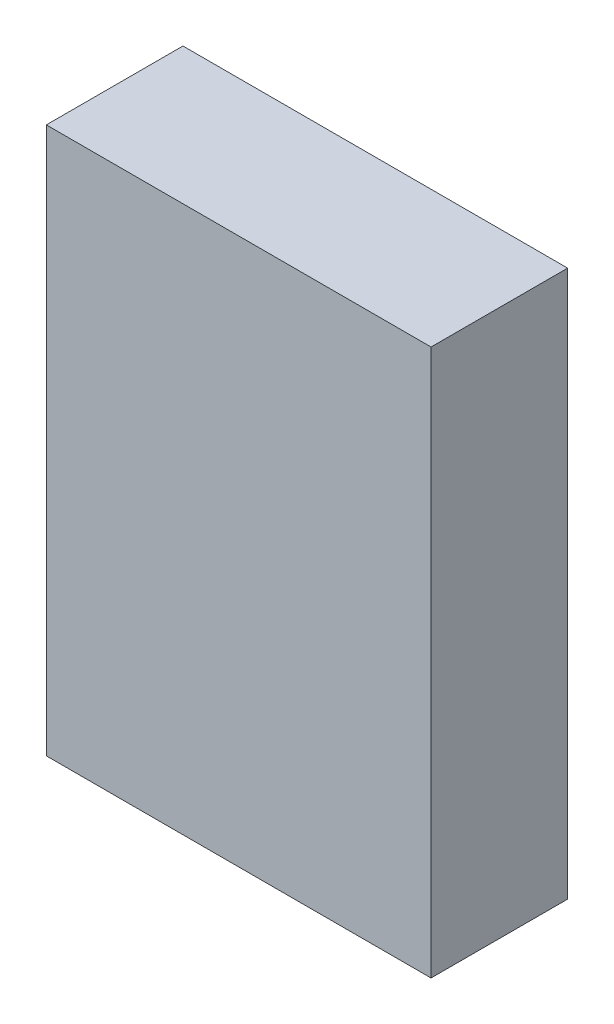
ISO-10303-21;
HEADER;
FILE_DESCRIPTION(('STEP AP214'),'2;1');
FILE_NAME('part.step','',(''),(''),'','','');
FILE_SCHEMA(('AUTOMOTIVE_DESIGN { 1 0 10303 214 1 1 1 1 }'));
ENDSEC;
DATA;
#1=APPLICATION_CONTEXT('core data for automotive mechanical design processes');
#2=APPLICATION_PROTOCOL_DEFINITION('international standard','automotive_design',2000,#1);
#3=PRODUCT_CONTEXT('',#1,'mechanical');
#4=PRODUCT('Part','Part','',(#3));
#5=PRODUCT_RELATED_PRODUCT_CATEGORY('part','',(#4));
#6=PRODUCT_DEFINITION_FORMATION('','',#4);
#7=PRODUCT_DEFINITION_CONTEXT('part definition',#1,'design');
#8=PRODUCT_DEFINITION('design','',#6,#7);
#9=PRODUCT_DEFINITION_SHAPE('','',#8);
#10=(LENGTH_UNIT() NAMED_UNIT(*) SI_UNIT(.MILLI.,.METRE.));
#11=(NAMED_UNIT(*) PLANE_ANGLE_UNIT() SI_UNIT($,.RADIAN.));
#12=(NAMED_UNIT(*) SI_UNIT($,.STERADIAN.) SOLID_ANGLE_UNIT());
#13=UNCERTAINTY_MEASURE_WITH_UNIT(LENGTH_MEASURE(1.E-05),#10,'distance_accuracy_value','');
#14=(GEOMETRIC_REPRESENTATION_CONTEXT(3) GLOBAL_UNCERTAINTY_ASSIGNED_CONTEXT((#13)) GLOBAL_UNIT_ASSIGNED_CONTEXT((#10,
#11,#12)) REPRESENTATION_CONTEXT('',''));
#15=CARTESIAN_POINT('',(0.,0.,0.));
#16=DIRECTION('',(0.,0.,1.));
#17=DIRECTION('',(1.,0.,0.));
#18=AXIS2_PLACEMENT_3D('',#15,#16,#17);
#19=CARTESIAN_POINT('',(0.,0.,50.));
#20=DIRECTION('',(-1.,0.,0.));
#21=DIRECTION('',(0.,-1.,0.));
#22=AXIS2_PLACEMENT_3D('',#19,#20,#21);
#23=PLANE('',#22);
#24=DIRECTION('',(0.,1.,0.));
#25=VECTOR('',#24,1.);
#26=CARTESIAN_POINT('',(0.,0.,0.));
#27=LINE('',#26,#25);
#28=CARTESIAN_POINT('',(0.,-200.,0.));
#29=VERTEX_POINT('',#28);
#30=CARTESIAN_POINT('',(0.,0.,0.));
#31=VERTEX_POINT('',#30);
#32=EDGE_CURVE('E96',#29,#31,#27,.T.);
#33=ORIENTED_EDGE('',*,*,#32,.T.);
#34=DIRECTION('',(0.,0.,-1.));
#35=VECTOR('',#34,1.);
#36=CARTESIAN_POINT('',(0.,0.,50.));
#37=LINE('',#36,#35);
#38=CARTESIAN_POINT('',(0.,0.,50.));
#39=VERTEX_POINT('',#38);
#40=EDGE_CURVE('E11',#39,#31,#37,.T.);
#41=ORIENTED_EDGE('',*,*,#40,.F.);
#42=DIRECTION('',(0.,1.,0.));
#43=VECTOR('',#42,1.);
#44=CARTESIAN_POINT('',(0.,0.,50.));
#45=LINE('',#44,#43);
#46=CARTESIAN_POINT('',(0.,-200.,50.));
#47=VERTEX_POINT('',#46);
#48=EDGE_CURVE('E84',#47,#39,#45,.T.);
#49=ORIENTED_EDGE('',*,*,#48,.F.);
#50=DIRECTION('',(0.,0.,-1.));
#51=VECTOR('',#50,1.);
#52=CARTESIAN_POINT('',(0.,-200.,50.));
#53=LINE('',#52,#51);
#54=EDGE_CURVE('E92',#47,#29,#53,.T.);
#55=ORIENTED_EDGE('',*,*,#54,.T.);
#56=EDGE_LOOP('',(#33,#41,#49,#55));
#57=FACE_BOUND('',#56,.T.);
#58=ADVANCED_FACE('F33',(#57),#23,.F.);
#59=CARTESIAN_POINT('',(0.,0.,50.));
#60=DIRECTION('',(0.,-1.,0.));
#61=DIRECTION('',(1.,0.,0.));
#62=AXIS2_PLACEMENT_3D('',#59,#60,#61);
#63=PLANE('',#62);
#64=DIRECTION('',(-1.,0.,0.));
#65=VECTOR('',#64,1.);
#66=CARTESIAN_POINT('',(0.,0.,0.));
#67=LINE('',#66,#65);
#68=CARTESIAN_POINT('',(-140.8,0.,0.));
#69=VERTEX_POINT('',#68);
#70=EDGE_CURVE('E88',#31,#69,#67,.T.);
#71=ORIENTED_EDGE('',*,*,#70,.T.);
#72=DIRECTION('',(0.,0.,-1.));
#73=VECTOR('',#72,1.);
#74=CARTESIAN_POINT('',(-140.8,0.,50.));
#75=LINE('',#74,#73);
#76=CARTESIAN_POINT('',(-140.8,0.,50.));
#77=VERTEX_POINT('',#76);
#78=EDGE_CURVE('E41',#77,#69,#75,.T.);
#79=ORIENTED_EDGE('',*,*,#78,.F.);
#80=DIRECTION('',(-1.,0.,0.));
#81=VECTOR('',#80,1.);
#82=CARTESIAN_POINT('',(0.,0.,50.));
#83=LINE('',#82,#81);
#84=EDGE_CURVE('E79',#39,#77,#83,.T.);
#85=ORIENTED_EDGE('',*,*,#84,.F.);
#86=ORIENTED_EDGE('',*,*,#40,.T.);
#87=EDGE_LOOP('',(#71,#79,#85,#86));
#88=FACE_BOUND('',#87,.T.);
#89=ADVANCED_FACE('F87',(#88),#63,.F.);
#90=CARTESIAN_POINT('',(-140.8,0.,50.));
#91=DIRECTION('',(1.,0.,0.));
#92=DIRECTION('',(0.,1.,0.));
#93=AXIS2_PLACEMENT_3D('',#90,#91,#92);
#94=PLANE('',#93);
#95=DIRECTION('',(0.,-1.,0.));
#96=VECTOR('',#95,1.);
#97=CARTESIAN_POINT('',(-140.8,0.,0.));
#98=LINE('',#97,#96);
#99=CARTESIAN_POINT('',(-140.8,-200.,0.));
#100=VERTEX_POINT('',#99);
#101=EDGE_CURVE('E66',#69,#100,#98,.T.);
#102=ORIENTED_EDGE('',*,*,#101,.T.);
#103=DIRECTION('',(0.,0.,-1.));
#104=VECTOR('',#103,1.);
#105=CARTESIAN_POINT('',(-140.8,-200.,50.));
#106=LINE('',#105,#104);
#107=CARTESIAN_POINT('',(-140.8,-200.,50.));
#108=VERTEX_POINT('',#107);
#109=EDGE_CURVE('E89',#108,#100,#106,.T.);
#110=ORIENTED_EDGE('',*,*,#109,.F.);
#111=DIRECTION('',(0.,-1.,0.));
#112=VECTOR('',#111,1.);
#113=CARTESIAN_POINT('',(-140.8,0.,50.));
#114=LINE('',#113,#112);
#115=EDGE_CURVE('E82',#77,#108,#114,.T.);
#116=ORIENTED_EDGE('',*,*,#115,.F.);
#117=ORIENTED_EDGE('',*,*,#78,.T.);
#118=EDGE_LOOP('',(#102,#110,#116,#117));
#119=FACE_BOUND('',#118,.T.);
#120=ADVANCED_FACE('F90',(#119),#94,.F.);
#121=CARTESIAN_POINT('',(0.,-200.,50.));
#122=DIRECTION('',(0.,1.,0.));
#123=DIRECTION('',(-1.,0.,0.));
#124=AXIS2_PLACEMENT_3D('',#121,#122,#123);
#125=PLANE('',#124);
#126=DIRECTION('',(1.,0.,0.));
#127=VECTOR('',#126,1.);
#128=CARTESIAN_POINT('',(0.,-200.,0.));
#129=LINE('',#128,#127);
#130=EDGE_CURVE('E72',#100,#29,#129,.T.);
#131=ORIENTED_EDGE('',*,*,#130,.T.);
#132=ORIENTED_EDGE('',*,*,#54,.F.);
#133=DIRECTION('',(1.,0.,0.));
#134=VECTOR('',#133,1.);
#135=CARTESIAN_POINT('',(0.,-200.,50.));
#136=LINE('',#135,#134);
#137=EDGE_CURVE('E49',#108,#47,#136,.T.);
#138=ORIENTED_EDGE('',*,*,#137,.F.);
#139=ORIENTED_EDGE('',*,*,#109,.T.);
#140=EDGE_LOOP('',(#131,#132,#138,#139));
#141=FACE_BOUND('',#140,.T.);
#142=ADVANCED_FACE('F103',(#141),#125,.F.);
#143=CARTESIAN_POINT('',(0.,0.,50.));
#144=DIRECTION('',(0.,0.,-1.));
#145=DIRECTION('',(-1.,0.,0.));
#146=AXIS2_PLACEMENT_3D('',#143,#144,#145);
#147=PLANE('',#146);
#148=ORIENTED_EDGE('',*,*,#48,.T.);
#149=ORIENTED_EDGE('',*,*,#84,.T.);
#150=ORIENTED_EDGE('',*,*,#115,.T.);
#151=ORIENTED_EDGE('',*,*,#137,.T.);
#152=EDGE_LOOP('',(#148,#149,#150,#151));
#153=FACE_BOUND('',#152,.T.);
#154=ADVANCED_FACE('F80',(#153),#147,.F.);
#155=CARTESIAN_POINT('',(0.,0.,0.));
#156=DIRECTION('',(0.,0.,-1.));
#157=DIRECTION('',(-1.,0.,0.));
#158=AXIS2_PLACEMENT_3D('',#155,#156,#157);
#159=PLANE('',#158);
#160=ORIENTED_EDGE('',*,*,#32,.F.);
#161=ORIENTED_EDGE('',*,*,#130,.F.);
#162=ORIENTED_EDGE('',*,*,#101,.F.);
#163=ORIENTED_EDGE('',*,*,#70,.F.);
#164=EDGE_LOOP('',(#160,#161,#162,#163));
#165=FACE_BOUND('',#164,.T.);
#166=ADVANCED_FACE('F106',(#165),#159,.T.);
#167=CLOSED_SHELL('',(#58,#89,#120,#142,#154,#166));
#168=MANIFOLD_SOLID_BREP('B2',#167);
#169=ADVANCED_BREP_SHAPE_REPRESENTATION('',(#18,#168),#14);
#170=SHAPE_DEFINITION_REPRESENTATION(#9,#169);
ENDSEC;
END-ISO-10303-21;
